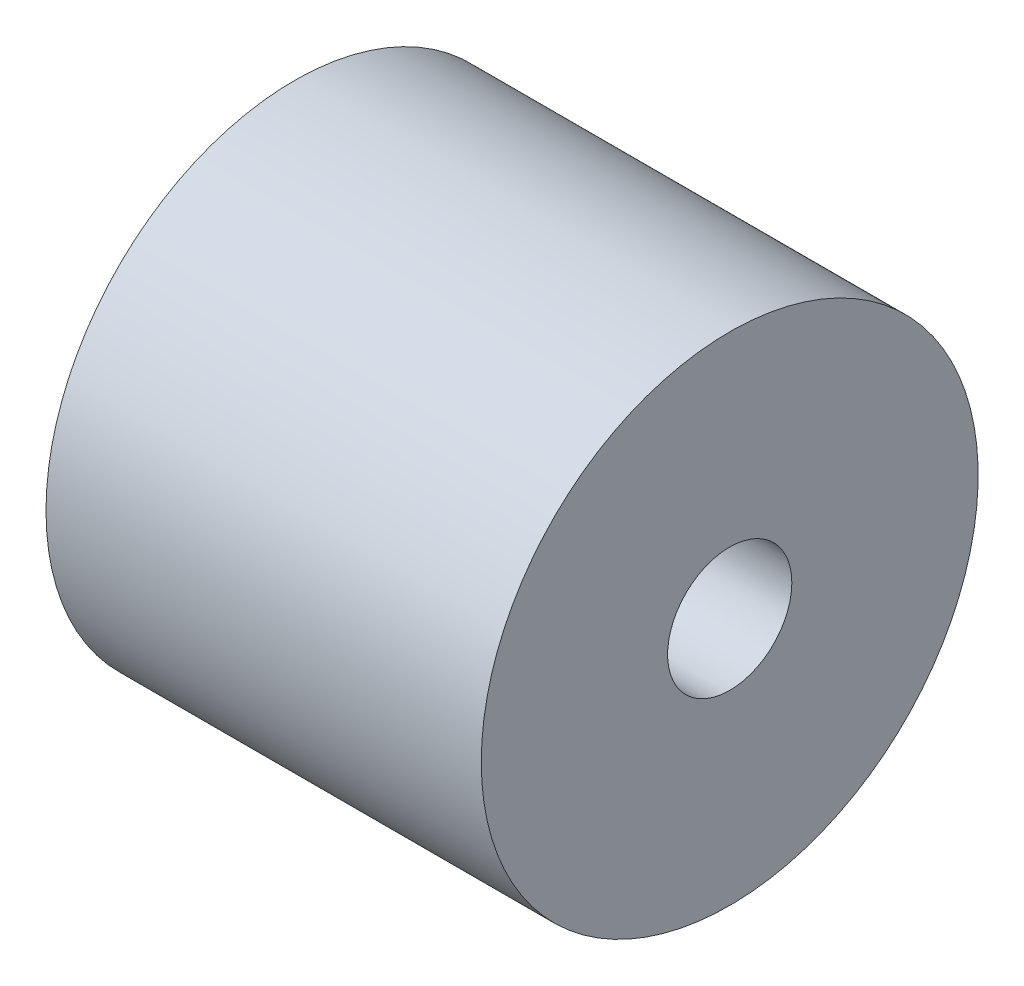
ISO-10303-21;
HEADER;
FILE_DESCRIPTION(('STEP AP214'),'2;1');
FILE_NAME('part.step','',(''),(''),'','','');
FILE_SCHEMA(('AUTOMOTIVE_DESIGN { 1 0 10303 214 1 1 1 1 }'));
ENDSEC;
DATA;
#1=APPLICATION_CONTEXT('core data for automotive mechanical design processes');
#2=APPLICATION_PROTOCOL_DEFINITION('international standard','automotive_design',2000,#1);
#3=PRODUCT_CONTEXT('',#1,'mechanical');
#4=PRODUCT('Part','Part','',(#3));
#5=PRODUCT_RELATED_PRODUCT_CATEGORY('part','',(#4));
#6=PRODUCT_DEFINITION_FORMATION('','',#4);
#7=PRODUCT_DEFINITION_CONTEXT('part definition',#1,'design');
#8=PRODUCT_DEFINITION('design','',#6,#7);
#9=PRODUCT_DEFINITION_SHAPE('','',#8);
#10=(LENGTH_UNIT() NAMED_UNIT(*) SI_UNIT(.MILLI.,.METRE.));
#11=(NAMED_UNIT(*) PLANE_ANGLE_UNIT() SI_UNIT($,.RADIAN.));
#12=(NAMED_UNIT(*) SI_UNIT($,.STERADIAN.) SOLID_ANGLE_UNIT());
#13=UNCERTAINTY_MEASURE_WITH_UNIT(LENGTH_MEASURE(1.E-05),#10,'distance_accuracy_value','');
#14=(GEOMETRIC_REPRESENTATION_CONTEXT(3) GLOBAL_UNCERTAINTY_ASSIGNED_CONTEXT((#13)) GLOBAL_UNIT_ASSIGNED_CONTEXT((#10,
#11,#12)) REPRESENTATION_CONTEXT('',''));
#15=CARTESIAN_POINT('',(0.,0.,0.));
#16=DIRECTION('',(0.,0.,1.));
#17=DIRECTION('',(1.,0.,0.));
#18=AXIS2_PLACEMENT_3D('',#15,#16,#17);
#19=CARTESIAN_POINT('',(11.1252,0.,0.));
#20=DIRECTION('',(-1.,0.,0.));
#21=DIRECTION('',(0.,0.,1.));
#22=AXIS2_PLACEMENT_3D('',#19,#20,#21);
#23=CYLINDRICAL_SURFACE('',#22,3.175);
#24=CARTESIAN_POINT('',(0.,0.,0.));
#25=DIRECTION('',(1.,0.,0.));
#26=DIRECTION('',(0.,0.,-1.));
#27=AXIS2_PLACEMENT_3D('',#24,#25,#26);
#28=CIRCLE('',#27,3.175);
#29=CARTESIAN_POINT('',(0.,0.,3.175));
#30=VERTEX_POINT('',#29);
#31=EDGE_CURVE('E53',#30,#30,#28,.T.);
#32=CARTESIAN_POINT('',(5.5626,0.,0.));
#33=DIRECTION('',(1.,0.,0.));
#34=DIRECTION('',(0.,0.,-1.));
#35=AXIS2_PLACEMENT_3D('',#32,#33,#34);
#36=CIRCLE('',#35,3.175);
#37=CARTESIAN_POINT('',(5.5626,0.,3.175));
#38=VERTEX_POINT('',#37);
#39=EDGE_CURVE('E57',#38,#38,#36,.T.);
#40=CARTESIAN_POINT('',(0.,0.,3.175));
#41=CARTESIAN_POINT('',(0.0579437499999998,0.,3.175));
#42=CARTESIAN_POINT('',(0.115887499999999,0.,3.175));
#43=CARTESIAN_POINT('',(0.231774999999999,0.,3.175));
#44=CARTESIAN_POINT('',(0.28971875,0.,3.175));
#45=CARTESIAN_POINT('',(0.40560625,0.,3.175));
#46=CARTESIAN_POINT('',(0.463550000000001,0.,3.175));
#47=CARTESIAN_POINT('',(0.579437500000001,0.,3.175));
#48=CARTESIAN_POINT('',(0.63738125,0.,3.175));
#49=CARTESIAN_POINT('',(0.75326875,0.,3.175));
#50=CARTESIAN_POINT('',(0.8112125,0.,3.175));
#51=CARTESIAN_POINT('',(0.9271,0.,3.175));
#52=CARTESIAN_POINT('',(0.98504375,0.,3.175));
#53=CARTESIAN_POINT('',(1.10093125,0.,3.175));
#54=CARTESIAN_POINT('',(1.158875,0.,3.175));
#55=CARTESIAN_POINT('',(1.2747625,0.,3.175));
#56=CARTESIAN_POINT('',(1.33270625,0.,3.175));
#57=CARTESIAN_POINT('',(1.44859375,0.,3.175));
#58=CARTESIAN_POINT('',(1.5065375,0.,3.175));
#59=CARTESIAN_POINT('',(1.622425,0.,3.175));
#60=CARTESIAN_POINT('',(1.68036875,0.,3.175));
#61=CARTESIAN_POINT('',(1.79625625,0.,3.175));
#62=CARTESIAN_POINT('',(1.8542,0.,3.175));
#63=CARTESIAN_POINT('',(1.9700875,0.,3.175));
#64=CARTESIAN_POINT('',(2.02803125,0.,3.175));
#65=CARTESIAN_POINT('',(2.14391875,0.,3.175));
#66=CARTESIAN_POINT('',(2.2018625,0.,3.175));
#67=CARTESIAN_POINT('',(2.31775,0.,3.175));
#68=CARTESIAN_POINT('',(2.37569375,0.,3.175));
#69=CARTESIAN_POINT('',(2.49158125,0.,3.175));
#70=CARTESIAN_POINT('',(2.549525,0.,3.175));
#71=CARTESIAN_POINT('',(2.6654125,0.,3.175));
#72=CARTESIAN_POINT('',(2.72335625,0.,3.175));
#73=CARTESIAN_POINT('',(2.83924375,0.,3.175));
#74=CARTESIAN_POINT('',(2.8971875,0.,3.175));
#75=CARTESIAN_POINT('',(3.013075,0.,3.175));
#76=CARTESIAN_POINT('',(3.07101875,0.,3.175));
#77=CARTESIAN_POINT('',(3.18690625,0.,3.175));
#78=CARTESIAN_POINT('',(3.24485,0.,3.175));
#79=CARTESIAN_POINT('',(3.3607375,0.,3.175));
#80=CARTESIAN_POINT('',(3.41868125,0.,3.175));
#81=CARTESIAN_POINT('',(3.53456875,0.,3.175));
#82=CARTESIAN_POINT('',(3.5925125,0.,3.175));
#83=CARTESIAN_POINT('',(3.7084,0.,3.175));
#84=CARTESIAN_POINT('',(3.76634375,0.,3.175));
#85=CARTESIAN_POINT('',(3.88223125,0.,3.175));
#86=CARTESIAN_POINT('',(3.940175,0.,3.175));
#87=CARTESIAN_POINT('',(4.0560625,0.,3.175));
#88=CARTESIAN_POINT('',(4.11400625,0.,3.175));
#89=CARTESIAN_POINT('',(4.22989375,0.,3.175));
#90=CARTESIAN_POINT('',(4.2878375,0.,3.175));
#91=CARTESIAN_POINT('',(4.403725,0.,3.175));
#92=CARTESIAN_POINT('',(4.46166875,0.,3.175));
#93=CARTESIAN_POINT('',(4.57755625,0.,3.175));
#94=CARTESIAN_POINT('',(4.6355,0.,3.175));
#95=CARTESIAN_POINT('',(4.7513875,0.,3.175));
#96=CARTESIAN_POINT('',(4.80933125,0.,3.175));
#97=CARTESIAN_POINT('',(4.92521875,0.,3.175));
#98=CARTESIAN_POINT('',(4.9831625,0.,3.175));
#99=CARTESIAN_POINT('',(5.09905,0.,3.175));
#100=CARTESIAN_POINT('',(5.15699375,0.,3.175));
#101=CARTESIAN_POINT('',(5.27288125,0.,3.175));
#102=CARTESIAN_POINT('',(5.330825,0.,3.175));
#103=CARTESIAN_POINT('',(5.4467125,0.,3.175));
#104=CARTESIAN_POINT('',(5.50465625,0.,3.175));
#105=CARTESIAN_POINT('',(5.5626,0.,3.175));
#106=B_SPLINE_CURVE_WITH_KNOTS('',3,(#40,#41,#42,#43,#44,#45,#46,#47,#48,#49,#50,#51,#52,#53,
#54,#55,#56,#57,#58,#59,#60,#61,#62,#63,#64,#65,#66,#67,#68,#69,#70,#71,#72,#73,#74,#75,#76,#77,
#78,#79,#80,#81,#82,#83,#84,#85,#86,#87,#88,#89,#90,#91,#92,#93,#94,#95,#96,#97,#98,#99,#100,
#101,#102,#103,#104,#105),.UNSPECIFIED.,.F.,.F.,(4,2,2,2,2,2,2,2,2,2,2,2,2,2,2,2,2,2,2,2,2,2,2,
2,2,2,2,2,2,2,2,2,4),(0.,0.173831249999999,0.3476625,0.521493750000001,0.695325,
0.869156249999999,1.0429875,1.21681875,1.39065,1.56448125,1.7383125,1.91214375,2.085975,
2.25980625,2.4336375,2.60746875,2.7813,2.95513125,3.1289625,3.30279375,3.476625,3.65045625,
3.8242875,3.99811875,4.17195,4.34578125,4.5196125,4.69344375,4.867275,5.04110625,5.2149375,
5.38876875,5.5626),.UNSPECIFIED.);
#107=EDGE_CURVE('BSEAM42',#30,#38,#106,.T.);
#108=ORIENTED_EDGE('',*,*,#31,.F.);
#109=ORIENTED_EDGE('',*,*,#39,.T.);
#110=ORIENTED_EDGE('',*,*,#107,.T.);
#111=ORIENTED_EDGE('',*,*,#107,.F.);
#112=EDGE_LOOP('',(#108,#110,#109,#111));
#113=FACE_BOUND('',#112,.T.);
#114=ADVANCED_FACE('F42',(#113),#23,.F.);
#115=CARTESIAN_POINT('',(11.1252,0.,0.));
#116=DIRECTION('',(1.,0.,0.));
#117=DIRECTION('',(0.,0.,-1.));
#118=AXIS2_PLACEMENT_3D('',#115,#116,#117);
#119=PLANE('',#118);
#120=CARTESIAN_POINT('',(11.1252,0.,0.));
#121=DIRECTION('',(1.,0.,0.));
#122=DIRECTION('',(0.,0.,-1.));
#123=AXIS2_PLACEMENT_3D('',#120,#121,#122);
#124=CIRCLE('',#123,6.35);
#125=CARTESIAN_POINT('',(11.1252,0.,6.35));
#126=VERTEX_POINT('',#125);
#127=EDGE_CURVE('E12',#126,#126,#124,.T.);
#128=ORIENTED_EDGE('',*,*,#127,.T.);
#129=EDGE_LOOP('',(#128));
#130=FACE_BOUND('',#129,.T.);
#131=CARTESIAN_POINT('',(11.1252,0.,0.));
#132=DIRECTION('',(1.,0.,0.));
#133=DIRECTION('',(0.,0.,-1.));
#134=AXIS2_PLACEMENT_3D('',#131,#132,#133);
#135=CIRCLE('',#134,1.5875);
#136=CARTESIAN_POINT('',(11.1252,0.,-1.5875));
#137=VERTEX_POINT('',#136);
#138=EDGE_CURVE('E61',#137,#137,#135,.T.);
#139=ORIENTED_EDGE('',*,*,#138,.F.);
#140=EDGE_LOOP('',(#139));
#141=FACE_BOUND('',#140,.T.);
#142=ADVANCED_FACE('F76',(#130,#141),#119,.T.);
#143=CARTESIAN_POINT('',(0.,0.,0.));
#144=DIRECTION('',(1.,0.,0.));
#145=DIRECTION('',(0.,0.,-1.));
#146=AXIS2_PLACEMENT_3D('',#143,#144,#145);
#147=PLANE('',#146);
#148=CARTESIAN_POINT('',(0.,0.,0.));
#149=DIRECTION('',(1.,0.,0.));
#150=DIRECTION('',(0.,0.,-1.));
#151=AXIS2_PLACEMENT_3D('',#148,#149,#150);
#152=CIRCLE('',#151,6.35);
#153=CARTESIAN_POINT('',(0.,0.,6.35));
#154=VERTEX_POINT('',#153);
#155=EDGE_CURVE('E46',#154,#154,#152,.T.);
#156=ORIENTED_EDGE('',*,*,#155,.F.);
#157=EDGE_LOOP('',(#156));
#158=FACE_BOUND('',#157,.T.);
#159=ORIENTED_EDGE('',*,*,#31,.T.);
#160=EDGE_LOOP('',(#159));
#161=FACE_BOUND('',#160,.T.);
#162=ADVANCED_FACE('F78',(#158,#161),#147,.F.);
#163=CARTESIAN_POINT('',(11.1252,0.,0.));
#164=DIRECTION('',(-1.,0.,0.));
#165=DIRECTION('',(0.,0.,1.));
#166=AXIS2_PLACEMENT_3D('',#163,#164,#165);
#167=CYLINDRICAL_SURFACE('',#166,6.35);
#168=CARTESIAN_POINT('',(11.1252,0.,6.35));
#169=CARTESIAN_POINT('',(11.0093125,0.,6.35));
#170=CARTESIAN_POINT('',(10.893425,0.,6.35));
#171=CARTESIAN_POINT('',(10.66165,0.,6.35));
#172=CARTESIAN_POINT('',(10.5457625,0.,6.35));
#173=CARTESIAN_POINT('',(10.3139875,0.,6.35));
#174=CARTESIAN_POINT('',(10.1981,0.,6.35));
#175=CARTESIAN_POINT('',(9.966325,0.,6.35));
#176=CARTESIAN_POINT('',(9.8504375,0.,6.35));
#177=CARTESIAN_POINT('',(9.6186625,0.,6.35));
#178=CARTESIAN_POINT('',(9.502775,0.,6.35));
#179=CARTESIAN_POINT('',(9.271,0.,6.35));
#180=CARTESIAN_POINT('',(9.1551125,0.,6.35));
#181=CARTESIAN_POINT('',(8.9233375,0.,6.35));
#182=CARTESIAN_POINT('',(8.80745,0.,6.35));
#183=CARTESIAN_POINT('',(8.575675,0.,6.35));
#184=CARTESIAN_POINT('',(8.4597875,0.,6.35));
#185=CARTESIAN_POINT('',(8.2280125,0.,6.35));
#186=CARTESIAN_POINT('',(8.112125,0.,6.35));
#187=CARTESIAN_POINT('',(7.88035,0.,6.35));
#188=CARTESIAN_POINT('',(7.7644625,0.,6.35));
#189=CARTESIAN_POINT('',(7.5326875,0.,6.35));
#190=CARTESIAN_POINT('',(7.4168,0.,6.35));
#191=CARTESIAN_POINT('',(7.185025,0.,6.35));
#192=CARTESIAN_POINT('',(7.0691375,0.,6.35));
#193=CARTESIAN_POINT('',(6.8373625,0.,6.35));
#194=CARTESIAN_POINT('',(6.721475,0.,6.35));
#195=CARTESIAN_POINT('',(6.4897,0.,6.35));
#196=CARTESIAN_POINT('',(6.3738125,0.,6.35));
#197=CARTESIAN_POINT('',(6.1420375,0.,6.35));
#198=CARTESIAN_POINT('',(6.02615,0.,6.35));
#199=CARTESIAN_POINT('',(5.794375,0.,6.35));
#200=CARTESIAN_POINT('',(5.6784875,0.,6.35));
#201=CARTESIAN_POINT('',(5.4467125,0.,6.35));
#202=CARTESIAN_POINT('',(5.330825,0.,6.35));
#203=CARTESIAN_POINT('',(5.09905,0.,6.35));
#204=CARTESIAN_POINT('',(4.9831625,0.,6.35));
#205=CARTESIAN_POINT('',(4.7513875,0.,6.35));
#206=CARTESIAN_POINT('',(4.6355,0.,6.35));
#207=CARTESIAN_POINT('',(4.403725,0.,6.35));
#208=CARTESIAN_POINT('',(4.2878375,0.,6.35));
#209=CARTESIAN_POINT('',(4.0560625,0.,6.35));
#210=CARTESIAN_POINT('',(3.940175,0.,6.35));
#211=CARTESIAN_POINT('',(3.7084,0.,6.35));
#212=CARTESIAN_POINT('',(3.5925125,0.,6.35));
#213=CARTESIAN_POINT('',(3.3607375,0.,6.35));
#214=CARTESIAN_POINT('',(3.24485,0.,6.35));
#215=CARTESIAN_POINT('',(3.013075,0.,6.35));
#216=CARTESIAN_POINT('',(2.8971875,0.,6.35));
#217=CARTESIAN_POINT('',(2.6654125,0.,6.35));
#218=CARTESIAN_POINT('',(2.549525,0.,6.35));
#219=CARTESIAN_POINT('',(2.31775,0.,6.35));
#220=CARTESIAN_POINT('',(2.2018625,0.,6.35));
#221=CARTESIAN_POINT('',(1.9700875,0.,6.35));
#222=CARTESIAN_POINT('',(1.8542,0.,6.35));
#223=CARTESIAN_POINT('',(1.622425,0.,6.35));
#224=CARTESIAN_POINT('',(1.5065375,0.,6.35));
#225=CARTESIAN_POINT('',(1.2747625,0.,6.35));
#226=CARTESIAN_POINT('',(1.158875,0.,6.35));
#227=CARTESIAN_POINT('',(0.9271,0.,6.35));
#228=CARTESIAN_POINT('',(0.8112125,0.,6.35));
#229=CARTESIAN_POINT('',(0.5794375,0.,6.35));
#230=CARTESIAN_POINT('',(0.46355,0.,6.35));
#231=CARTESIAN_POINT('',(0.231775,0.,6.35));
#232=CARTESIAN_POINT('',(0.1158875,0.,6.35));
#233=CARTESIAN_POINT('',(0.,0.,6.35));
#234=B_SPLINE_CURVE_WITH_KNOTS('',3,(#168,#169,#170,#171,#172,#173,#174,#175,#176,#177,#178,
#179,#180,#181,#182,#183,#184,#185,#186,#187,#188,#189,#190,#191,#192,#193,#194,#195,#196,#197,
#198,#199,#200,#201,#202,#203,#204,#205,#206,#207,#208,#209,#210,#211,#212,#213,#214,#215,#216,
#217,#218,#219,#220,#221,#222,#223,#224,#225,#226,#227,#228,#229,#230,#231,#232,#233),
.UNSPECIFIED.,.F.,.F.,(4,2,2,2,2,2,2,2,2,2,2,2,2,2,2,2,2,2,2,2,2,2,2,2,2,2,2,2,2,2,2,2,4),(0.,
0.3476625,0.695325,1.0429875,1.39065,1.7383125,2.085975,2.4336375,2.7813,3.1289625,3.476625,
3.8242875,4.17195,4.5196125,4.867275,5.2149375,5.5626,5.9102625,6.257925,6.6055875,6.95325,
7.3009125,7.648575,7.9962375,8.3439,8.6915625,9.039225,9.3868875,9.73455,10.0822125,10.429875,
10.7775375,11.1252),.UNSPECIFIED.);
#235=EDGE_CURVE('BSEAM44',#126,#154,#234,.T.);
#236=ORIENTED_EDGE('',*,*,#127,.F.);
#237=ORIENTED_EDGE('',*,*,#155,.T.);
#238=ORIENTED_EDGE('',*,*,#235,.T.);
#239=ORIENTED_EDGE('',*,*,#235,.F.);
#240=EDGE_LOOP('',(#236,#238,#237,#239));
#241=FACE_BOUND('',#240,.T.);
#242=ADVANCED_FACE('F44',(#241),#167,.T.);
#243=CARTESIAN_POINT('',(5.5626,0.,0.));
#244=DIRECTION('',(1.,0.,0.));
#245=DIRECTION('',(0.,0.,-1.));
#246=AXIS2_PLACEMENT_3D('',#243,#244,#245);
#247=PLANE('',#246);
#248=CARTESIAN_POINT('',(5.5626,0.,0.));
#249=DIRECTION('',(1.,0.,0.));
#250=DIRECTION('',(0.,0.,-1.));
#251=AXIS2_PLACEMENT_3D('',#248,#249,#250);
#252=CIRCLE('',#251,1.5875);
#253=CARTESIAN_POINT('',(5.5626,0.,-1.5875));
#254=VERTEX_POINT('',#253);
#255=EDGE_CURVE('E60',#254,#254,#252,.T.);
#256=ORIENTED_EDGE('',*,*,#255,.T.);
#257=EDGE_LOOP('',(#256));
#258=FACE_BOUND('',#257,.T.);
#259=ORIENTED_EDGE('',*,*,#39,.F.);
#260=EDGE_LOOP('',(#259));
#261=FACE_BOUND('',#260,.T.);
#262=ADVANCED_FACE('F67',(#258,#261),#247,.F.);
#263=CARTESIAN_POINT('',(5.5626,0.,0.));
#264=DIRECTION('',(1.,0.,0.));
#265=DIRECTION('',(0.,0.,-1.));
#266=AXIS2_PLACEMENT_3D('',#263,#264,#265);
#267=CYLINDRICAL_SURFACE('',#266,1.5875);
#268=CARTESIAN_POINT('',(5.5626,0.,-1.5875));
#269=CARTESIAN_POINT('',(5.62054375,0.,-1.5875));
#270=CARTESIAN_POINT('',(5.6784875,0.,-1.5875));
#271=CARTESIAN_POINT('',(5.794375,0.,-1.5875));
#272=CARTESIAN_POINT('',(5.85231875,0.,-1.5875));
#273=CARTESIAN_POINT('',(5.96820625,0.,-1.5875));
#274=CARTESIAN_POINT('',(6.02615,0.,-1.5875));
#275=CARTESIAN_POINT('',(6.1420375,0.,-1.5875));
#276=CARTESIAN_POINT('',(6.19998125,0.,-1.5875));
#277=CARTESIAN_POINT('',(6.31586875,0.,-1.5875));
#278=CARTESIAN_POINT('',(6.3738125,0.,-1.5875));
#279=CARTESIAN_POINT('',(6.4897,0.,-1.5875));
#280=CARTESIAN_POINT('',(6.54764375,0.,-1.5875));
#281=CARTESIAN_POINT('',(6.66353125,0.,-1.5875));
#282=CARTESIAN_POINT('',(6.721475,0.,-1.5875));
#283=CARTESIAN_POINT('',(6.8373625,0.,-1.5875));
#284=CARTESIAN_POINT('',(6.89530625,0.,-1.5875));
#285=CARTESIAN_POINT('',(7.01119375,0.,-1.5875));
#286=CARTESIAN_POINT('',(7.0691375,0.,-1.5875));
#287=CARTESIAN_POINT('',(7.185025,0.,-1.5875));
#288=CARTESIAN_POINT('',(7.24296875,0.,-1.5875));
#289=CARTESIAN_POINT('',(7.35885625,0.,-1.5875));
#290=CARTESIAN_POINT('',(7.4168,0.,-1.5875));
#291=CARTESIAN_POINT('',(7.5326875,0.,-1.5875));
#292=CARTESIAN_POINT('',(7.59063125,0.,-1.5875));
#293=CARTESIAN_POINT('',(7.70651875,0.,-1.5875));
#294=CARTESIAN_POINT('',(7.7644625,0.,-1.5875));
#295=CARTESIAN_POINT('',(7.88035,0.,-1.5875));
#296=CARTESIAN_POINT('',(7.93829375,0.,-1.5875));
#297=CARTESIAN_POINT('',(8.05418125,0.,-1.5875));
#298=CARTESIAN_POINT('',(8.112125,0.,-1.5875));
#299=CARTESIAN_POINT('',(8.2280125,0.,-1.5875));
#300=CARTESIAN_POINT('',(8.28595625,0.,-1.5875));
#301=CARTESIAN_POINT('',(8.40184375,0.,-1.5875));
#302=CARTESIAN_POINT('',(8.4597875,0.,-1.5875));
#303=CARTESIAN_POINT('',(8.575675,0.,-1.5875));
#304=CARTESIAN_POINT('',(8.63361875,0.,-1.5875));
#305=CARTESIAN_POINT('',(8.74950625,0.,-1.5875));
#306=CARTESIAN_POINT('',(8.80745,0.,-1.5875));
#307=CARTESIAN_POINT('',(8.9233375,0.,-1.5875));
#308=CARTESIAN_POINT('',(8.98128125,0.,-1.5875));
#309=CARTESIAN_POINT('',(9.09716875,0.,-1.5875));
#310=CARTESIAN_POINT('',(9.1551125,0.,-1.5875));
#311=CARTESIAN_POINT('',(9.271,0.,-1.5875));
#312=CARTESIAN_POINT('',(9.32894375,0.,-1.5875));
#313=CARTESIAN_POINT('',(9.44483125,0.,-1.5875));
#314=CARTESIAN_POINT('',(9.502775,0.,-1.5875));
#315=CARTESIAN_POINT('',(9.6186625,0.,-1.5875));
#316=CARTESIAN_POINT('',(9.67660625,0.,-1.5875));
#317=CARTESIAN_POINT('',(9.79249375,0.,-1.5875));
#318=CARTESIAN_POINT('',(9.8504375,0.,-1.5875));
#319=CARTESIAN_POINT('',(9.966325,0.,-1.5875));
#320=CARTESIAN_POINT('',(10.02426875,0.,-1.5875));
#321=CARTESIAN_POINT('',(10.14015625,0.,-1.5875));
#322=CARTESIAN_POINT('',(10.1981,0.,-1.5875));
#323=CARTESIAN_POINT('',(10.3139875,0.,-1.5875));
#324=CARTESIAN_POINT('',(10.37193125,0.,-1.5875));
#325=CARTESIAN_POINT('',(10.48781875,0.,-1.5875));
#326=CARTESIAN_POINT('',(10.5457625,0.,-1.5875));
#327=CARTESIAN_POINT('',(10.66165,0.,-1.5875));
#328=CARTESIAN_POINT('',(10.71959375,0.,-1.5875));
#329=CARTESIAN_POINT('',(10.83548125,0.,-1.5875));
#330=CARTESIAN_POINT('',(10.893425,0.,-1.5875));
#331=CARTESIAN_POINT('',(11.0093125,0.,-1.5875));
#332=CARTESIAN_POINT('',(11.06725625,0.,-1.5875));
#333=CARTESIAN_POINT('',(11.1252,0.,-1.5875));
#334=B_SPLINE_CURVE_WITH_KNOTS('',3,(#268,#269,#270,#271,#272,#273,#274,#275,#276,#277,#278,
#279,#280,#281,#282,#283,#284,#285,#286,#287,#288,#289,#290,#291,#292,#293,#294,#295,#296,#297,
#298,#299,#300,#301,#302,#303,#304,#305,#306,#307,#308,#309,#310,#311,#312,#313,#314,#315,#316,
#317,#318,#319,#320,#321,#322,#323,#324,#325,#326,#327,#328,#329,#330,#331,#332,#333),
.UNSPECIFIED.,.F.,.F.,(4,2,2,2,2,2,2,2,2,2,2,2,2,2,2,2,2,2,2,2,2,2,2,2,2,2,2,2,2,2,2,2,4),(0.,
0.173831250000001,0.3476625,0.521493750000001,0.695325,0.869156250000001,1.0429875,1.21681875,
1.39065,1.56448125,1.7383125,1.91214375,2.085975,2.25980625,2.4336375,2.60746875,2.7813,
2.95513125,3.1289625,3.30279375,3.476625,3.65045625,3.8242875,3.99811875,4.17195,4.34578125,
4.5196125,4.69344375,4.867275,5.04110625,5.2149375,5.38876875,5.5626),.UNSPECIFIED.);
#335=EDGE_CURVE('BSEAM70',#254,#137,#334,.T.);
#336=ORIENTED_EDGE('',*,*,#255,.F.);
#337=ORIENTED_EDGE('',*,*,#138,.T.);
#338=ORIENTED_EDGE('',*,*,#335,.T.);
#339=ORIENTED_EDGE('',*,*,#335,.F.);
#340=EDGE_LOOP('',(#336,#338,#337,#339));
#341=FACE_BOUND('',#340,.T.);
#342=ADVANCED_FACE('F70',(#341),#267,.F.);
#343=CLOSED_SHELL('',(#114,#142,#162,#242,#262,#342));
#344=MANIFOLD_SOLID_BREP('B2',#343);
#345=ADVANCED_BREP_SHAPE_REPRESENTATION('',(#18,#344),#14);
#346=SHAPE_DEFINITION_REPRESENTATION(#9,#345);
ENDSEC;
END-ISO-10303-21;
